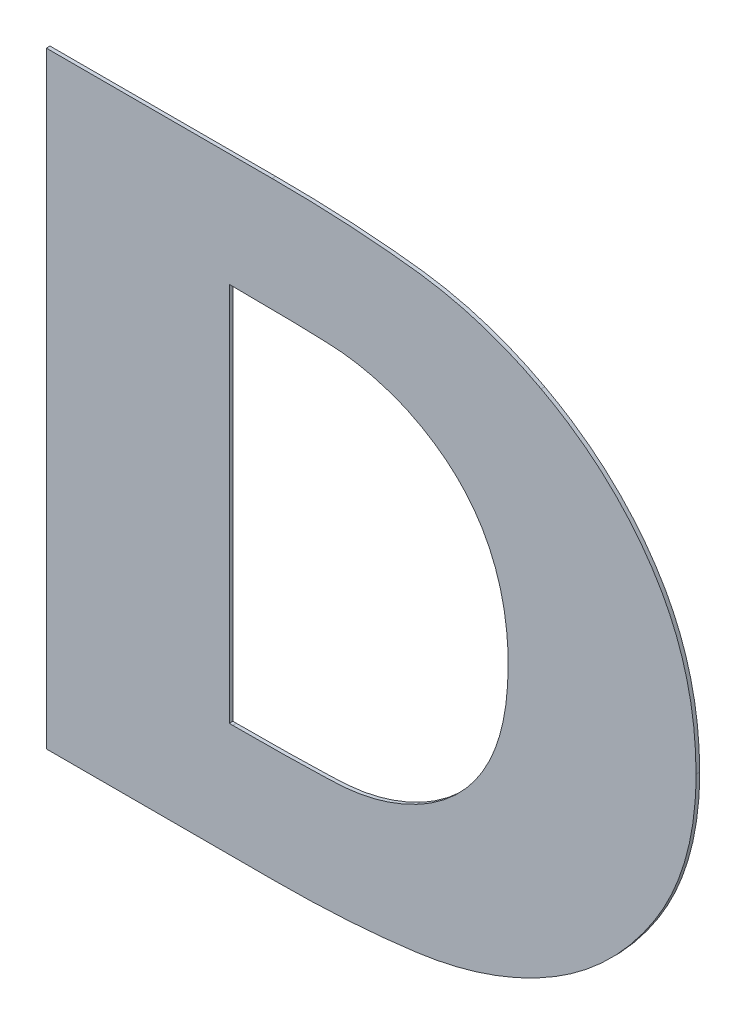
ISO-10303-21;
HEADER;
FILE_DESCRIPTION(('STEP AP214'),'2;1');
FILE_NAME('part.step','',(''),(''),'','','');
FILE_SCHEMA(('AUTOMOTIVE_DESIGN { 1 0 10303 214 1 1 1 1 }'));
ENDSEC;
DATA;
#1=APPLICATION_CONTEXT('core data for automotive mechanical design processes');
#2=APPLICATION_PROTOCOL_DEFINITION('international standard','automotive_design',2000,#1);
#3=PRODUCT_CONTEXT('',#1,'mechanical');
#4=PRODUCT('Part','Part','',(#3));
#5=PRODUCT_RELATED_PRODUCT_CATEGORY('part','',(#4));
#6=PRODUCT_DEFINITION_FORMATION('','',#4);
#7=PRODUCT_DEFINITION_CONTEXT('part definition',#1,'design');
#8=PRODUCT_DEFINITION('design','',#6,#7);
#9=PRODUCT_DEFINITION_SHAPE('','',#8);
#10=(LENGTH_UNIT() NAMED_UNIT(*) SI_UNIT(.MILLI.,.METRE.));
#11=(NAMED_UNIT(*) PLANE_ANGLE_UNIT() SI_UNIT($,.RADIAN.));
#12=(NAMED_UNIT(*) SI_UNIT($,.STERADIAN.) SOLID_ANGLE_UNIT());
#13=UNCERTAINTY_MEASURE_WITH_UNIT(LENGTH_MEASURE(1.E-05),#10,'distance_accuracy_value','');
#14=(GEOMETRIC_REPRESENTATION_CONTEXT(3) GLOBAL_UNCERTAINTY_ASSIGNED_CONTEXT((#13)) GLOBAL_UNIT_ASSIGNED_CONTEXT((#10,
#11,#12)) REPRESENTATION_CONTEXT('',''));
#15=CARTESIAN_POINT('',(0.,0.,0.));
#16=DIRECTION('',(0.,0.,1.));
#17=DIRECTION('',(1.,0.,0.));
#18=AXIS2_PLACEMENT_3D('',#15,#16,#17);
#19=CARTESIAN_POINT('',(1.434505499508,-2.255593155182,0.));
#20=DIRECTION('',(0.,-1.,0.));
#21=DIRECTION('',(1.,0.,0.));
#22=AXIS2_PLACEMENT_3D('',#19,#20,#21);
#23=PLANE('',#22);
#24=DIRECTION('',(1.,0.,0.));
#25=VECTOR('',#24,1.);
#26=CARTESIAN_POINT('',(1.434505499508,-2.255593155182,0.));
#27=LINE('',#26,#25);
#28=CARTESIAN_POINT('',(1.434505499508,-2.255593155182,0.));
#29=VERTEX_POINT('',#28);
#30=CARTESIAN_POINT('',(1.437339383924,-2.255593155182,0.));
#31=VERTEX_POINT('',#30);
#32=EDGE_CURVE('E11',#29,#31,#27,.T.);
#33=ORIENTED_EDGE('',*,*,#32,.T.);
#34=DIRECTION('',(0.,0.,1.));
#35=VECTOR('',#34,1.);
#36=CARTESIAN_POINT('',(1.437339383924,-2.255593155182,0.));
#37=LINE('',#36,#35);
#38=CARTESIAN_POINT('',(1.437339383924,-2.255593155182,0.003));
#39=VERTEX_POINT('',#38);
#40=EDGE_CURVE('E24',#31,#39,#37,.T.);
#41=ORIENTED_EDGE('',*,*,#40,.T.);
#42=DIRECTION('',(1.,0.,0.));
#43=VECTOR('',#42,1.);
#44=CARTESIAN_POINT('',(1.434505499508,-2.255593155182,0.003));
#45=LINE('',#44,#43);
#46=CARTESIAN_POINT('',(1.434505499508,-2.255593155182,0.003));
#47=VERTEX_POINT('',#46);
#48=EDGE_CURVE('E318',#47,#39,#45,.T.);
#49=ORIENTED_EDGE('',*,*,#48,.F.);
#50=DIRECTION('',(0.,0.,1.));
#51=VECTOR('',#50,1.);
#52=CARTESIAN_POINT('',(1.434505499508,-2.255593155182,0.));
#53=LINE('',#52,#51);
#54=EDGE_CURVE('E315',#29,#47,#53,.T.);
#55=ORIENTED_EDGE('',*,*,#54,.F.);
#56=EDGE_LOOP('',(#33,#41,#49,#55));
#57=FACE_BOUND('',#56,.T.);
#58=ADVANCED_FACE('F17',(#57),#23,.T.);
#59=CARTESIAN_POINT('',(1.434505499508,-2.568534962904,0.));
#60=DIRECTION('',(1.,0.,0.));
#61=DIRECTION('',(0.,1.,0.));
#62=AXIS2_PLACEMENT_3D('',#59,#60,#61);
#63=PLANE('',#62);
#64=DIRECTION('',(0.,1.,0.));
#65=VECTOR('',#64,1.);
#66=CARTESIAN_POINT('',(1.434505499508,-2.568534962904,0.));
#67=LINE('',#66,#65);
#68=CARTESIAN_POINT('',(1.434505499508,-2.568534962904,0.));
#69=VERTEX_POINT('',#68);
#70=EDGE_CURVE('E312',#69,#29,#67,.T.);
#71=ORIENTED_EDGE('',*,*,#70,.T.);
#72=ORIENTED_EDGE('',*,*,#54,.T.);
#73=DIRECTION('',(0.,1.,0.));
#74=VECTOR('',#73,1.);
#75=CARTESIAN_POINT('',(1.434505499508,-2.568534962904,0.003));
#76=LINE('',#75,#74);
#77=CARTESIAN_POINT('',(1.434505499508,-2.568534962904,0.003));
#78=VERTEX_POINT('',#77);
#79=EDGE_CURVE('E309',#78,#47,#76,.T.);
#80=ORIENTED_EDGE('',*,*,#79,.F.);
#81=DIRECTION('',(0.,0.,1.));
#82=VECTOR('',#81,1.);
#83=CARTESIAN_POINT('',(1.434505499508,-2.568534962904,0.));
#84=LINE('',#83,#82);
#85=EDGE_CURVE('E306',#69,#78,#84,.T.);
#86=ORIENTED_EDGE('',*,*,#85,.F.);
#87=EDGE_LOOP('',(#71,#72,#80,#86));
#88=FACE_BOUND('',#87,.T.);
#89=ADVANCED_FACE('F337',(#88),#63,.T.);
#90=CARTESIAN_POINT('',(1.437339383924,-2.568534962904,0.));
#91=DIRECTION('',(0.,1.,0.));
#92=DIRECTION('',(-1.,0.,0.));
#93=AXIS2_PLACEMENT_3D('',#90,#91,#92);
#94=PLANE('',#93);
#95=DIRECTION('',(-1.,0.,0.));
#96=VECTOR('',#95,1.);
#97=CARTESIAN_POINT('',(1.437339383924,-2.568534962904,0.));
#98=LINE('',#97,#96);
#99=CARTESIAN_POINT('',(1.437339383924,-2.568534962904,0.));
#100=VERTEX_POINT('',#99);
#101=EDGE_CURVE('E303',#100,#69,#98,.T.);
#102=ORIENTED_EDGE('',*,*,#101,.T.);
#103=ORIENTED_EDGE('',*,*,#85,.T.);
#104=DIRECTION('',(-1.,0.,0.));
#105=VECTOR('',#104,1.);
#106=CARTESIAN_POINT('',(1.437339383924,-2.568534962904,0.003));
#107=LINE('',#106,#105);
#108=CARTESIAN_POINT('',(1.437339383924,-2.568534962904,0.003));
#109=VERTEX_POINT('',#108);
#110=EDGE_CURVE('E300',#109,#78,#107,.T.);
#111=ORIENTED_EDGE('',*,*,#110,.F.);
#112=DIRECTION('',(0.,0.,1.));
#113=VECTOR('',#112,1.);
#114=CARTESIAN_POINT('',(1.437339383924,-2.568534962904,0.));
#115=LINE('',#114,#113);
#116=EDGE_CURVE('E294',#100,#109,#115,.T.);
#117=ORIENTED_EDGE('',*,*,#116,.F.);
#118=EDGE_LOOP('',(#102,#103,#111,#117));
#119=FACE_BOUND('',#118,.T.);
#120=ADVANCED_FACE('F334',(#119),#94,.T.);
#121=CARTESIAN_POINT('',(1.588749779898,-2.549102612618,0.));
#122=CARTESIAN_POINT('',(1.588749779898,-2.549102612618,0.003));
#123=CARTESIAN_POINT('',(1.557172210685,-2.565701078487,0.));
#124=CARTESIAN_POINT('',(1.557172210685,-2.565701078487,0.003));
#125=CARTESIAN_POINT('',(1.487944462792,-2.568534962904,0.));
#126=CARTESIAN_POINT('',(1.487944462792,-2.568534962904,0.003));
#127=CARTESIAN_POINT('',(1.437339383924,-2.568534962904,0.));
#128=CARTESIAN_POINT('',(1.437339383924,-2.568534962904,0.003));
#129=B_SPLINE_SURFACE_WITH_KNOTS('',2,1,((#121,#122),(#123,#124),(#125,#126),(#127,#128)),
.UNSPECIFIED.,.F.,.F.,.F.,(3,1,3),(2,2),(-2.,-1.,0.),(0.,0.0003),.UNSPECIFIED.);
#130=CARTESIAN_POINT('',(1.588749779898,-2.549102612618,0.));
#131=CARTESIAN_POINT('',(1.557172210685,-2.565701078487,0.));
#132=CARTESIAN_POINT('',(1.487944462792,-2.568534962904,0.));
#133=CARTESIAN_POINT('',(1.437339383924,-2.568534962904,0.));
#134=B_SPLINE_CURVE_WITH_KNOTS('',2,(#130,#131,#132,#133),.UNSPECIFIED.,.F.,.F.,(3,1,3),(-2.,
-1.,0.),.UNSPECIFIED.);
#135=CARTESIAN_POINT('',(1.588749779898,-2.549102612618,0.));
#136=VERTEX_POINT('',#135);
#137=EDGE_CURVE('E286',#136,#100,#134,.T.);
#138=CARTESIAN_POINT('',(1.588749779898,-2.549102612618,0.003));
#139=CARTESIAN_POINT('',(1.557172210685,-2.565701078487,0.003));
#140=CARTESIAN_POINT('',(1.487944462792,-2.568534962904,0.003));
#141=CARTESIAN_POINT('',(1.437339383924,-2.568534962904,0.003));
#142=B_SPLINE_CURVE_WITH_KNOTS('',2,(#138,#139,#140,#141),.UNSPECIFIED.,.F.,.F.,(3,1,3),(-2.,
-1.,0.),.UNSPECIFIED.);
#143=CARTESIAN_POINT('',(1.588749779898,-2.549102612618,0.003));
#144=VERTEX_POINT('',#143);
#145=EDGE_CURVE('E281',#144,#109,#142,.T.);
#146=DIRECTION('',(0.,0.,1.));
#147=VECTOR('',#146,1.);
#148=CARTESIAN_POINT('',(1.588749779898,-2.549102612618,0.));
#149=LINE('',#148,#147);
#150=EDGE_CURVE('E275',#136,#144,#149,.T.);
#151=ORIENTED_EDGE('',*,*,#137,.T.);
#152=ORIENTED_EDGE('',*,*,#116,.T.);
#153=ORIENTED_EDGE('',*,*,#145,.F.);
#154=ORIENTED_EDGE('',*,*,#150,.F.);
#155=EDGE_LOOP('',(#151,#152,#153,#154));
#156=FACE_BOUND('',#155,.T.);
#157=ADVANCED_FACE('F331',(#156),#129,.T.);
#158=CARTESIAN_POINT('',(1.664050137254,-2.411861638727,0.));
#159=CARTESIAN_POINT('',(1.664050137254,-2.411861638727,0.003));
#160=CARTESIAN_POINT('',(1.664050137793,-2.461252195703,0.));
#161=CARTESIAN_POINT('',(1.664050137793,-2.461252195703,0.003));
#162=CARTESIAN_POINT('',(1.625590278599,-2.529670262752,0.));
#163=CARTESIAN_POINT('',(1.625590278599,-2.529670262752,0.003));
#164=CARTESIAN_POINT('',(1.588749779898,-2.549102612618,0.));
#165=CARTESIAN_POINT('',(1.588749779898,-2.549102612618,0.003));
#166=B_SPLINE_SURFACE_WITH_KNOTS('',2,1,((#158,#159),(#160,#161),(#162,#163),(#164,#165)),
.UNSPECIFIED.,.F.,.F.,.F.,(3,1,3),(2,2),(-2.,-1.,0.),(0.,0.0003),.UNSPECIFIED.);
#167=CARTESIAN_POINT('',(1.664050137254,-2.411861638727,0.));
#168=CARTESIAN_POINT('',(1.664050137793,-2.461252195703,0.));
#169=CARTESIAN_POINT('',(1.625590278599,-2.529670262752,0.));
#170=CARTESIAN_POINT('',(1.588749779898,-2.549102612618,0.));
#171=B_SPLINE_CURVE_WITH_KNOTS('',2,(#167,#168,#169,#170),.UNSPECIFIED.,.F.,.F.,(3,1,3),(-2.,
-1.,0.),.UNSPECIFIED.);
#172=CARTESIAN_POINT('',(1.664050137254,-2.411861638727,0.));
#173=VERTEX_POINT('',#172);
#174=EDGE_CURVE('E267',#173,#136,#171,.T.);
#175=CARTESIAN_POINT('',(1.664050137254,-2.411861638727,0.003));
#176=CARTESIAN_POINT('',(1.664050137793,-2.461252195703,0.003));
#177=CARTESIAN_POINT('',(1.625590278599,-2.529670262752,0.003));
#178=CARTESIAN_POINT('',(1.588749779898,-2.549102612618,0.003));
#179=B_SPLINE_CURVE_WITH_KNOTS('',2,(#175,#176,#177,#178),.UNSPECIFIED.,.F.,.F.,(3,1,3),(-2.,
-1.,0.),.UNSPECIFIED.);
#180=CARTESIAN_POINT('',(1.664050137254,-2.411861638727,0.003));
#181=VERTEX_POINT('',#180);
#182=EDGE_CURVE('E262',#181,#144,#179,.T.);
#183=DIRECTION('',(0.,0.,1.));
#184=VECTOR('',#183,1.);
#185=CARTESIAN_POINT('',(1.664050137254,-2.411861638727,0.));
#186=LINE('',#185,#184);
#187=EDGE_CURVE('E256',#173,#181,#186,.T.);
#188=ORIENTED_EDGE('',*,*,#174,.T.);
#189=ORIENTED_EDGE('',*,*,#150,.T.);
#190=ORIENTED_EDGE('',*,*,#182,.F.);
#191=ORIENTED_EDGE('',*,*,#187,.F.);
#192=EDGE_LOOP('',(#188,#189,#190,#191));
#193=FACE_BOUND('',#192,.T.);
#194=ADVANCED_FACE('F328',(#193),#166,.T.);
#195=CARTESIAN_POINT('',(1.581462648541,-2.272191621051,0.));
#196=CARTESIAN_POINT('',(1.581462648541,-2.272191621051,0.003));
#197=CARTESIAN_POINT('',(1.623566118499,-2.292028717859,0.));
#198=CARTESIAN_POINT('',(1.623566118499,-2.292028717859,0.003));
#199=CARTESIAN_POINT('',(1.664050339045,-2.362470897154,0.));
#200=CARTESIAN_POINT('',(1.664050339045,-2.362470897154,0.003));
#201=CARTESIAN_POINT('',(1.664050137254,-2.411861638727,0.));
#202=CARTESIAN_POINT('',(1.664050137254,-2.411861638727,0.003));
#203=B_SPLINE_SURFACE_WITH_KNOTS('',2,1,((#195,#196),(#197,#198),(#199,#200),(#201,#202)),
.UNSPECIFIED.,.F.,.F.,.F.,(3,1,3),(2,2),(-2.,-1.,0.),(0.,0.0003),.UNSPECIFIED.);
#204=CARTESIAN_POINT('',(1.581462648541,-2.272191621051,0.));
#205=CARTESIAN_POINT('',(1.623566118499,-2.292028717859,0.));
#206=CARTESIAN_POINT('',(1.664050339045,-2.362470897154,0.));
#207=CARTESIAN_POINT('',(1.664050137254,-2.411861638727,0.));
#208=B_SPLINE_CURVE_WITH_KNOTS('',2,(#204,#205,#206,#207),.UNSPECIFIED.,.F.,.F.,(3,1,3),(-2.,
-1.,0.),.UNSPECIFIED.);
#209=CARTESIAN_POINT('',(1.581462648541,-2.272191621051,0.));
#210=VERTEX_POINT('',#209);
#211=EDGE_CURVE('E248',#210,#173,#208,.T.);
#212=CARTESIAN_POINT('',(1.581462648541,-2.272191621051,0.003));
#213=CARTESIAN_POINT('',(1.623566118499,-2.292028717859,0.003));
#214=CARTESIAN_POINT('',(1.664050339045,-2.362470897154,0.003));
#215=CARTESIAN_POINT('',(1.664050137254,-2.411861638727,0.003));
#216=B_SPLINE_CURVE_WITH_KNOTS('',2,(#212,#213,#214,#215),.UNSPECIFIED.,.F.,.F.,(3,1,3),(-2.,
-1.,0.),.UNSPECIFIED.);
#217=CARTESIAN_POINT('',(1.581462648541,-2.272191621051,0.003));
#218=VERTEX_POINT('',#217);
#219=EDGE_CURVE('E243',#218,#181,#216,.T.);
#220=DIRECTION('',(0.,0.,1.));
#221=VECTOR('',#220,1.);
#222=CARTESIAN_POINT('',(1.581462648541,-2.272191621051,0.));
#223=LINE('',#222,#221);
#224=EDGE_CURVE('E237',#210,#218,#223,.T.);
#225=ORIENTED_EDGE('',*,*,#211,.T.);
#226=ORIENTED_EDGE('',*,*,#187,.T.);
#227=ORIENTED_EDGE('',*,*,#219,.F.);
#228=ORIENTED_EDGE('',*,*,#224,.F.);
#229=EDGE_LOOP('',(#225,#226,#227,#228));
#230=FACE_BOUND('',#229,.T.);
#231=ADVANCED_FACE('F325',(#230),#203,.T.);
#232=CARTESIAN_POINT('',(1.437339383924,-2.255593155182,0.));
#233=CARTESIAN_POINT('',(1.437339383924,-2.255593155182,0.003));
#234=CARTESIAN_POINT('',(1.483896056483,-2.255593155182,0.));
#235=CARTESIAN_POINT('',(1.483896056483,-2.255593155182,0.003));
#236=CARTESIAN_POINT('',(1.550694760589,-2.258427039598,0.));
#237=CARTESIAN_POINT('',(1.550694760589,-2.258427039598,0.003));
#238=CARTESIAN_POINT('',(1.581462648541,-2.272191621051,0.));
#239=CARTESIAN_POINT('',(1.581462648541,-2.272191621051,0.003));
#240=B_SPLINE_SURFACE_WITH_KNOTS('',2,1,((#232,#233),(#234,#235),(#236,#237),(#238,#239)),
.UNSPECIFIED.,.F.,.F.,.F.,(3,1,3),(2,2),(-2.,-1.,0.),(0.,0.0003),.UNSPECIFIED.);
#241=CARTESIAN_POINT('',(1.437339383924,-2.255593155182,0.));
#242=CARTESIAN_POINT('',(1.483896056483,-2.255593155182,0.));
#243=CARTESIAN_POINT('',(1.550694760589,-2.258427039598,0.));
#244=CARTESIAN_POINT('',(1.581462648541,-2.272191621051,0.));
#245=B_SPLINE_CURVE_WITH_KNOTS('',2,(#241,#242,#243,#244),.UNSPECIFIED.,.F.,.F.,(3,1,3),(-2.,
-1.,0.),.UNSPECIFIED.);
#246=EDGE_CURVE('E229',#31,#210,#245,.T.);
#247=CARTESIAN_POINT('',(1.437339383924,-2.255593155182,0.003));
#248=CARTESIAN_POINT('',(1.483896056483,-2.255593155182,0.003));
#249=CARTESIAN_POINT('',(1.550694760589,-2.258427039598,0.003));
#250=CARTESIAN_POINT('',(1.581462648541,-2.272191621051,0.003));
#251=B_SPLINE_CURVE_WITH_KNOTS('',2,(#247,#248,#249,#250),.UNSPECIFIED.,.F.,.F.,(3,1,3),(-2.,
-1.,0.),.UNSPECIFIED.);
#252=EDGE_CURVE('E224',#39,#218,#251,.T.);
#253=ORIENTED_EDGE('',*,*,#246,.T.);
#254=ORIENTED_EDGE('',*,*,#224,.T.);
#255=ORIENTED_EDGE('',*,*,#252,.F.);
#256=ORIENTED_EDGE('',*,*,#40,.F.);
#257=EDGE_LOOP('',(#253,#254,#255,#256));
#258=FACE_BOUND('',#257,.T.);
#259=ADVANCED_FACE('F322',(#258),#240,.T.);
#260=CARTESIAN_POINT('',(1.283904784796,-2.662053148652,0.));
#261=DIRECTION('',(0.,-1.,0.));
#262=DIRECTION('',(1.,0.,0.));
#263=AXIS2_PLACEMENT_3D('',#260,#261,#262);
#264=PLANE('',#263);
#265=DIRECTION('',(1.,0.,0.));
#266=VECTOR('',#265,1.);
#267=CARTESIAN_POINT('',(1.283904784796,-2.662053148652,0.));
#268=LINE('',#267,#266);
#269=CARTESIAN_POINT('',(1.283904784796,-2.662053148652,0.));
#270=VERTEX_POINT('',#269);
#271=CARTESIAN_POINT('',(1.471345996924,-2.662053148652,0.));
#272=VERTEX_POINT('',#271);
#273=EDGE_CURVE('E222',#270,#272,#268,.T.);
#274=ORIENTED_EDGE('',*,*,#273,.T.);
#275=DIRECTION('',(0.,0.,1.));
#276=VECTOR('',#275,1.);
#277=CARTESIAN_POINT('',(1.471345996924,-2.662053148652,0.));
#278=LINE('',#277,#276);
#279=CARTESIAN_POINT('',(1.471345996924,-2.662053148652,0.003));
#280=VERTEX_POINT('',#279);
#281=EDGE_CURVE('E220',#272,#280,#278,.T.);
#282=ORIENTED_EDGE('',*,*,#281,.T.);
#283=DIRECTION('',(1.,0.,0.));
#284=VECTOR('',#283,1.);
#285=CARTESIAN_POINT('',(1.283904784796,-2.662053148652,0.003));
#286=LINE('',#285,#284);
#287=CARTESIAN_POINT('',(1.283904784796,-2.662053148652,0.003));
#288=VERTEX_POINT('',#287);
#289=EDGE_CURVE('E139',#288,#280,#286,.T.);
#290=ORIENTED_EDGE('',*,*,#289,.F.);
#291=DIRECTION('',(0.,0.,1.));
#292=VECTOR('',#291,1.);
#293=CARTESIAN_POINT('',(1.283904784796,-2.662053148652,0.));
#294=LINE('',#293,#292);
#295=EDGE_CURVE('E216',#270,#288,#294,.T.);
#296=ORIENTED_EDGE('',*,*,#295,.F.);
#297=EDGE_LOOP('',(#274,#282,#290,#296));
#298=FACE_BOUND('',#297,.T.);
#299=ADVANCED_FACE('F387',(#298),#264,.T.);
#300=CARTESIAN_POINT('',(1.283904784796,-2.162479810064,0.));
#301=DIRECTION('',(-1.,0.,0.));
#302=DIRECTION('',(0.,-1.,0.));
#303=AXIS2_PLACEMENT_3D('',#300,#301,#302);
#304=PLANE('',#303);
#305=DIRECTION('',(0.,-1.,0.));
#306=VECTOR('',#305,1.);
#307=CARTESIAN_POINT('',(1.283904784796,-2.162479810064,0.));
#308=LINE('',#307,#306);
#309=CARTESIAN_POINT('',(1.283904784796,-2.162479810064,0.));
#310=VERTEX_POINT('',#309);
#311=EDGE_CURVE('E213',#310,#270,#308,.T.);
#312=ORIENTED_EDGE('',*,*,#311,.T.);
#313=ORIENTED_EDGE('',*,*,#295,.T.);
#314=DIRECTION('',(0.,-1.,0.));
#315=VECTOR('',#314,1.);
#316=CARTESIAN_POINT('',(1.283904784796,-2.162479810064,0.003));
#317=LINE('',#316,#315);
#318=CARTESIAN_POINT('',(1.283904784796,-2.162479810064,0.003));
#319=VERTEX_POINT('',#318);
#320=EDGE_CURVE('E211',#319,#288,#317,.T.);
#321=ORIENTED_EDGE('',*,*,#320,.F.);
#322=DIRECTION('',(0.,0.,1.));
#323=VECTOR('',#322,1.);
#324=CARTESIAN_POINT('',(1.283904784796,-2.162479810064,0.));
#325=LINE('',#324,#323);
#326=EDGE_CURVE('E208',#310,#319,#325,.T.);
#327=ORIENTED_EDGE('',*,*,#326,.F.);
#328=EDGE_LOOP('',(#312,#313,#321,#327));
#329=FACE_BOUND('',#328,.T.);
#330=ADVANCED_FACE('F395',(#329),#304,.T.);
#331=CARTESIAN_POINT('',(1.4697266344,-2.162479810064,0.));
#332=DIRECTION('',(0.,1.,0.));
#333=DIRECTION('',(-1.,0.,0.));
#334=AXIS2_PLACEMENT_3D('',#331,#332,#333);
#335=PLANE('',#334);
#336=DIRECTION('',(-1.,0.,0.));
#337=VECTOR('',#336,1.);
#338=CARTESIAN_POINT('',(1.4697266344,-2.162479810064,0.));
#339=LINE('',#338,#337);
#340=CARTESIAN_POINT('',(1.4697266344,-2.162479810064,0.));
#341=VERTEX_POINT('',#340);
#342=EDGE_CURVE('E205',#341,#310,#339,.T.);
#343=ORIENTED_EDGE('',*,*,#342,.T.);
#344=ORIENTED_EDGE('',*,*,#326,.T.);
#345=DIRECTION('',(-1.,0.,0.));
#346=VECTOR('',#345,1.);
#347=CARTESIAN_POINT('',(1.4697266344,-2.162479810064,0.003));
#348=LINE('',#347,#346);
#349=CARTESIAN_POINT('',(1.4697266344,-2.162479810064,0.003));
#350=VERTEX_POINT('',#349);
#351=EDGE_CURVE('E202',#350,#319,#348,.T.);
#352=ORIENTED_EDGE('',*,*,#351,.F.);
#353=DIRECTION('',(0.,0.,1.));
#354=VECTOR('',#353,1.);
#355=CARTESIAN_POINT('',(1.4697266344,-2.162479810064,0.));
#356=LINE('',#355,#354);
#357=EDGE_CURVE('E196',#341,#350,#356,.T.);
#358=ORIENTED_EDGE('',*,*,#357,.F.);
#359=EDGE_LOOP('',(#343,#344,#352,#358));
#360=FACE_BOUND('',#359,.T.);
#361=ADVANCED_FACE('F399',(#360),#335,.T.);
#362=CARTESIAN_POINT('',(1.691174459528,-2.201749351266,0.));
#363=CARTESIAN_POINT('',(1.691174459528,-2.201749351266,0.003));
#364=CARTESIAN_POINT('',(1.642998342544,-2.175839703171,0.));
#365=CARTESIAN_POINT('',(1.642998342544,-2.175839703171,0.003));
#366=CARTESIAN_POINT('',(1.532881648697,-2.16248031043,0.));
#367=CARTESIAN_POINT('',(1.532881648697,-2.16248031043,0.003));
#368=CARTESIAN_POINT('',(1.4697266344,-2.162479810064,0.));
#369=CARTESIAN_POINT('',(1.4697266344,-2.162479810064,0.003));
#370=B_SPLINE_SURFACE_WITH_KNOTS('',2,1,((#362,#363),(#364,#365),(#366,#367),(#368,#369)),
.UNSPECIFIED.,.F.,.F.,.F.,(3,1,3),(2,2),(-2.,-1.,0.),(0.,0.0003),.UNSPECIFIED.);
#371=CARTESIAN_POINT('',(1.691174459528,-2.201749351266,0.));
#372=CARTESIAN_POINT('',(1.642998342544,-2.175839703171,0.));
#373=CARTESIAN_POINT('',(1.532881648697,-2.16248031043,0.));
#374=CARTESIAN_POINT('',(1.4697266344,-2.162479810064,0.));
#375=B_SPLINE_CURVE_WITH_KNOTS('',2,(#371,#372,#373,#374),.UNSPECIFIED.,.F.,.F.,(3,1,3),(-2.,
-1.,0.),.UNSPECIFIED.);
#376=CARTESIAN_POINT('',(1.691174459528,-2.201749351266,0.));
#377=VERTEX_POINT('',#376);
#378=EDGE_CURVE('E188',#377,#341,#375,.T.);
#379=CARTESIAN_POINT('',(1.691174459528,-2.201749351266,0.003));
#380=CARTESIAN_POINT('',(1.642998342544,-2.175839703171,0.003));
#381=CARTESIAN_POINT('',(1.532881648697,-2.16248031043,0.003));
#382=CARTESIAN_POINT('',(1.4697266344,-2.162479810064,0.003));
#383=B_SPLINE_CURVE_WITH_KNOTS('',2,(#379,#380,#381,#382),.UNSPECIFIED.,.F.,.F.,(3,1,3),(-2.,
-1.,0.),.UNSPECIFIED.);
#384=CARTESIAN_POINT('',(1.691174459528,-2.201749351266,0.003));
#385=VERTEX_POINT('',#384);
#386=EDGE_CURVE('E183',#385,#350,#383,.T.);
#387=DIRECTION('',(0.,0.,1.));
#388=VECTOR('',#387,1.);
#389=CARTESIAN_POINT('',(1.691174459528,-2.201749351266,0.));
#390=LINE('',#389,#388);
#391=EDGE_CURVE('E177',#377,#385,#390,.T.);
#392=ORIENTED_EDGE('',*,*,#378,.T.);
#393=ORIENTED_EDGE('',*,*,#357,.T.);
#394=ORIENTED_EDGE('',*,*,#386,.F.);
#395=ORIENTED_EDGE('',*,*,#391,.F.);
#396=EDGE_LOOP('',(#392,#393,#394,#395));
#397=FACE_BOUND('',#396,.T.);
#398=ADVANCED_FACE('F403',(#397),#370,.T.);
#399=CARTESIAN_POINT('',(1.818699258276,-2.412671319989,0.));
#400=CARTESIAN_POINT('',(1.818699258276,-2.412671319989,0.003));
#401=CARTESIAN_POINT('',(1.818699185927,-2.34020484705,0.));
#402=CARTESIAN_POINT('',(1.818699185927,-2.34020484705,0.003));
#403=CARTESIAN_POINT('',(1.750281012592,-2.233326988787,0.));
#404=CARTESIAN_POINT('',(1.750281012592,-2.233326988787,0.003));
#405=CARTESIAN_POINT('',(1.691174459528,-2.201749351266,0.));
#406=CARTESIAN_POINT('',(1.691174459528,-2.201749351266,0.003));
#407=B_SPLINE_SURFACE_WITH_KNOTS('',2,1,((#399,#400),(#401,#402),(#403,#404),(#405,#406)),
.UNSPECIFIED.,.F.,.F.,.F.,(3,1,3),(2,2),(-2.,-1.,0.),(0.,0.0003),.UNSPECIFIED.);
#408=CARTESIAN_POINT('',(1.818699258276,-2.412671319989,0.));
#409=CARTESIAN_POINT('',(1.818699185927,-2.34020484705,0.));
#410=CARTESIAN_POINT('',(1.750281012592,-2.233326988787,0.));
#411=CARTESIAN_POINT('',(1.691174459528,-2.201749351266,0.));
#412=B_SPLINE_CURVE_WITH_KNOTS('',2,(#408,#409,#410,#411),.UNSPECIFIED.,.F.,.F.,(3,1,3),(-2.,
-1.,0.),.UNSPECIFIED.);
#413=CARTESIAN_POINT('',(1.818699258276,-2.412671319989,0.));
#414=VERTEX_POINT('',#413);
#415=EDGE_CURVE('E169',#414,#377,#412,.T.);
#416=CARTESIAN_POINT('',(1.818699258276,-2.412671319989,0.003));
#417=CARTESIAN_POINT('',(1.818699185927,-2.34020484705,0.003));
#418=CARTESIAN_POINT('',(1.750281012592,-2.233326988787,0.003));
#419=CARTESIAN_POINT('',(1.691174459528,-2.201749351266,0.003));
#420=B_SPLINE_CURVE_WITH_KNOTS('',2,(#416,#417,#418,#419),.UNSPECIFIED.,.F.,.F.,(3,1,3),(-2.,
-1.,0.),.UNSPECIFIED.);
#421=CARTESIAN_POINT('',(1.818699258276,-2.412671319989,0.003));
#422=VERTEX_POINT('',#421);
#423=EDGE_CURVE('E165',#422,#385,#420,.T.);
#424=DIRECTION('',(0.,0.,1.));
#425=VECTOR('',#424,1.);
#426=CARTESIAN_POINT('',(1.818699258276,-2.412671319989,0.));
#427=LINE('',#426,#425);
#428=EDGE_CURVE('E121',#414,#422,#427,.T.);
#429=ORIENTED_EDGE('',*,*,#415,.T.);
#430=ORIENTED_EDGE('',*,*,#391,.T.);
#431=ORIENTED_EDGE('',*,*,#423,.F.);
#432=ORIENTED_EDGE('',*,*,#428,.F.);
#433=EDGE_LOOP('',(#429,#430,#431,#432));
#434=FACE_BOUND('',#433,.T.);
#435=ADVANCED_FACE('F409',(#434),#407,.T.);
#436=CARTESIAN_POINT('',(1.689555097004,-2.62237876682,0.));
#437=CARTESIAN_POINT('',(1.689555097004,-2.62237876682,0.003));
#438=CARTESIAN_POINT('',(1.745423074569,-2.592825344983,0.));
#439=CARTESIAN_POINT('',(1.745423074569,-2.592825344983,0.003));
#440=CARTESIAN_POINT('',(1.818699118832,-2.482708620208,0.));
#441=CARTESIAN_POINT('',(1.818699118832,-2.482708620208,0.003));
#442=CARTESIAN_POINT('',(1.818699258276,-2.412671319989,0.));
#443=CARTESIAN_POINT('',(1.818699258276,-2.412671319989,0.003));
#444=B_SPLINE_SURFACE_WITH_KNOTS('',2,1,((#436,#437),(#438,#439),(#440,#441),(#442,#443)),
.UNSPECIFIED.,.F.,.F.,.F.,(3,1,3),(2,2),(-2.,-1.,0.),(0.,0.0003),.UNSPECIFIED.);
#445=CARTESIAN_POINT('',(1.689555097004,-2.62237876682,0.));
#446=CARTESIAN_POINT('',(1.745423074569,-2.592825344983,0.));
#447=CARTESIAN_POINT('',(1.818699118832,-2.482708620208,0.));
#448=CARTESIAN_POINT('',(1.818699258276,-2.412671319989,0.));
#449=B_SPLINE_CURVE_WITH_KNOTS('',2,(#445,#446,#447,#448),.UNSPECIFIED.,.F.,.F.,(3,1,3),(-2.,
-1.,0.),.UNSPECIFIED.);
#450=CARTESIAN_POINT('',(1.689555097004,-2.62237876682,0.));
#451=VERTEX_POINT('',#450);
#452=EDGE_CURVE('E125',#451,#414,#449,.T.);
#453=CARTESIAN_POINT('',(1.689555097004,-2.62237876682,0.003));
#454=CARTESIAN_POINT('',(1.745423074569,-2.592825344983,0.003));
#455=CARTESIAN_POINT('',(1.818699118832,-2.482708620208,0.003));
#456=CARTESIAN_POINT('',(1.818699258276,-2.412671319989,0.003));
#457=B_SPLINE_CURVE_WITH_KNOTS('',2,(#453,#454,#455,#456),.UNSPECIFIED.,.F.,.F.,(3,1,3),(-2.,
-1.,0.),.UNSPECIFIED.);
#458=CARTESIAN_POINT('',(1.689555097004,-2.62237876682,0.003));
#459=VERTEX_POINT('',#458);
#460=EDGE_CURVE('E114',#459,#422,#457,.T.);
#461=DIRECTION('',(0.,0.,1.));
#462=VECTOR('',#461,1.);
#463=CARTESIAN_POINT('',(1.689555097004,-2.62237876682,0.));
#464=LINE('',#463,#462);
#465=EDGE_CURVE('E118',#451,#459,#464,.T.);
#466=ORIENTED_EDGE('',*,*,#452,.T.);
#467=ORIENTED_EDGE('',*,*,#428,.T.);
#468=ORIENTED_EDGE('',*,*,#460,.F.);
#469=ORIENTED_EDGE('',*,*,#465,.F.);
#470=EDGE_LOOP('',(#466,#467,#468,#469));
#471=FACE_BOUND('',#470,.T.);
#472=ADVANCED_FACE('F117',(#471),#444,.T.);
#473=CARTESIAN_POINT('',(1.471345996924,-2.662053148652,0.));
#474=CARTESIAN_POINT('',(1.471345996924,-2.662053148652,0.003));
#475=CARTESIAN_POINT('',(1.533286613459,-2.662053109493,0.));
#476=CARTESIAN_POINT('',(1.533286613459,-2.662053109493,0.003));
#477=CARTESIAN_POINT('',(1.642998415231,-2.647478777419,0.));
#478=CARTESIAN_POINT('',(1.642998415231,-2.647478777419,0.003));
#479=CARTESIAN_POINT('',(1.689555097004,-2.62237876682,0.));
#480=CARTESIAN_POINT('',(1.689555097004,-2.62237876682,0.003));
#481=B_SPLINE_SURFACE_WITH_KNOTS('',2,1,((#473,#474),(#475,#476),(#477,#478),(#479,#480)),
.UNSPECIFIED.,.F.,.F.,.F.,(3,1,3),(2,2),(-2.,-1.,0.),(0.,0.0003),.UNSPECIFIED.);
#482=CARTESIAN_POINT('',(1.471345996924,-2.662053148652,0.));
#483=CARTESIAN_POINT('',(1.533286613459,-2.662053109493,0.));
#484=CARTESIAN_POINT('',(1.642998415231,-2.647478777419,0.));
#485=CARTESIAN_POINT('',(1.689555097004,-2.62237876682,0.));
#486=B_SPLINE_CURVE_WITH_KNOTS('',2,(#482,#483,#484,#485),.UNSPECIFIED.,.F.,.F.,(3,1,3),(-2.,
-1.,0.),.UNSPECIFIED.);
#487=EDGE_CURVE('E133',#272,#451,#486,.T.);
#488=CARTESIAN_POINT('',(1.471345996924,-2.662053148652,0.003));
#489=CARTESIAN_POINT('',(1.533286613459,-2.662053109493,0.003));
#490=CARTESIAN_POINT('',(1.642998415231,-2.647478777419,0.003));
#491=CARTESIAN_POINT('',(1.689555097004,-2.62237876682,0.003));
#492=B_SPLINE_CURVE_WITH_KNOTS('',2,(#488,#489,#490,#491),.UNSPECIFIED.,.F.,.F.,(3,1,3),(-2.,
-1.,0.),.UNSPECIFIED.);
#493=EDGE_CURVE('E131',#280,#459,#492,.T.);
#494=ORIENTED_EDGE('',*,*,#487,.T.);
#495=ORIENTED_EDGE('',*,*,#465,.T.);
#496=ORIENTED_EDGE('',*,*,#493,.F.);
#497=ORIENTED_EDGE('',*,*,#281,.F.);
#498=EDGE_LOOP('',(#494,#495,#496,#497));
#499=FACE_BOUND('',#498,.T.);
#500=ADVANCED_FACE('F129',(#499),#481,.T.);
#501=CARTESIAN_POINT('',(1.551302021536,-2.412266479358,0.003));
#502=DIRECTION('',(0.,0.,1.));
#503=DIRECTION('',(1.,0.,0.));
#504=AXIS2_PLACEMENT_3D('',#501,#502,#503);
#505=PLANE('',#504);
#506=ORIENTED_EDGE('',*,*,#493,.T.);
#507=ORIENTED_EDGE('',*,*,#460,.T.);
#508=ORIENTED_EDGE('',*,*,#423,.T.);
#509=ORIENTED_EDGE('',*,*,#386,.T.);
#510=ORIENTED_EDGE('',*,*,#351,.T.);
#511=ORIENTED_EDGE('',*,*,#320,.T.);
#512=ORIENTED_EDGE('',*,*,#289,.T.);
#513=EDGE_LOOP('',(#506,#507,#508,#509,#510,#511,#512));
#514=FACE_BOUND('',#513,.T.);
#515=ORIENTED_EDGE('',*,*,#252,.T.);
#516=ORIENTED_EDGE('',*,*,#219,.T.);
#517=ORIENTED_EDGE('',*,*,#182,.T.);
#518=ORIENTED_EDGE('',*,*,#145,.T.);
#519=ORIENTED_EDGE('',*,*,#110,.T.);
#520=ORIENTED_EDGE('',*,*,#79,.T.);
#521=ORIENTED_EDGE('',*,*,#48,.T.);
#522=EDGE_LOOP('',(#515,#516,#517,#518,#519,#520,#521));
#523=FACE_BOUND('',#522,.T.);
#524=ADVANCED_FACE('F136',(#514,#523),#505,.T.);
#525=CARTESIAN_POINT('',(1.551302021536,-2.412266479358,0.));
#526=DIRECTION('',(0.,0.,1.));
#527=DIRECTION('',(1.,0.,0.));
#528=AXIS2_PLACEMENT_3D('',#525,#526,#527);
#529=PLANE('',#528);
#530=ORIENTED_EDGE('',*,*,#487,.F.);
#531=ORIENTED_EDGE('',*,*,#273,.F.);
#532=ORIENTED_EDGE('',*,*,#311,.F.);
#533=ORIENTED_EDGE('',*,*,#342,.F.);
#534=ORIENTED_EDGE('',*,*,#378,.F.);
#535=ORIENTED_EDGE('',*,*,#415,.F.);
#536=ORIENTED_EDGE('',*,*,#452,.F.);
#537=EDGE_LOOP('',(#530,#531,#532,#533,#534,#535,#536));
#538=FACE_BOUND('',#537,.T.);
#539=ORIENTED_EDGE('',*,*,#246,.F.);
#540=ORIENTED_EDGE('',*,*,#32,.F.);
#541=ORIENTED_EDGE('',*,*,#70,.F.);
#542=ORIENTED_EDGE('',*,*,#101,.F.);
#543=ORIENTED_EDGE('',*,*,#137,.F.);
#544=ORIENTED_EDGE('',*,*,#174,.F.);
#545=ORIENTED_EDGE('',*,*,#211,.F.);
#546=EDGE_LOOP('',(#539,#540,#541,#542,#543,#544,#545));
#547=FACE_BOUND('',#546,.T.);
#548=ADVANCED_FACE('F338',(#538,#547),#529,.F.);
#549=CLOSED_SHELL('',(#58,#89,#120,#157,#194,#231,#259,#299,#330,#361,#398,#435,#472,#500,#524,#548));
#550=MANIFOLD_SOLID_BREP('B1',#549);
#551=ADVANCED_BREP_SHAPE_REPRESENTATION('',(#18,#550),#14);
#552=SHAPE_DEFINITION_REPRESENTATION(#9,#551);
ENDSEC;
END-ISO-10303-21;
